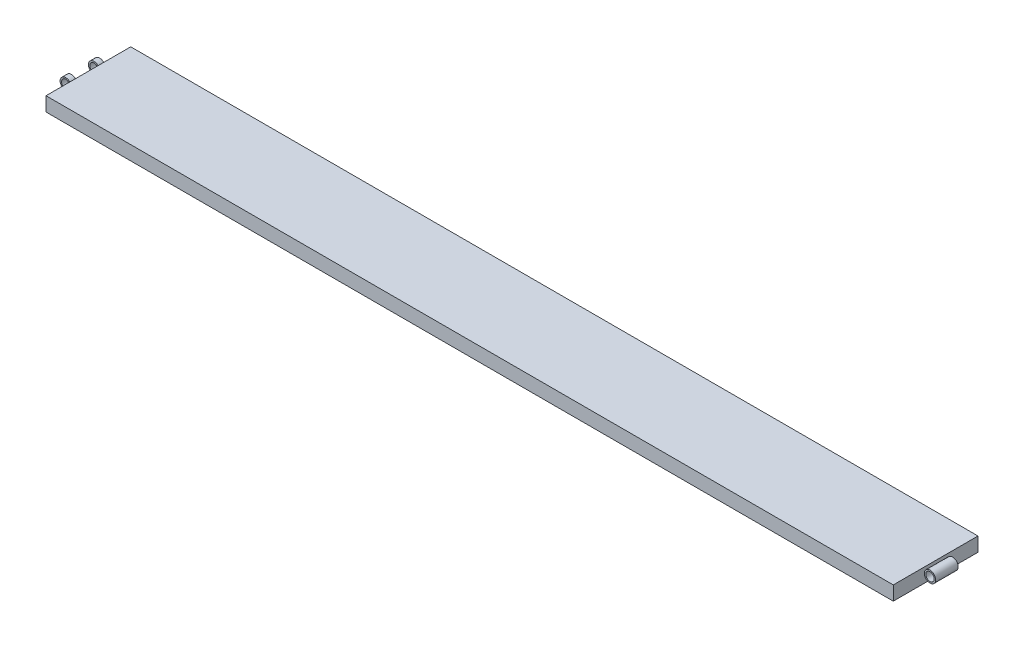
ISO-10303-21;
HEADER;
FILE_DESCRIPTION(('STEP AP214'),'2;1');
FILE_NAME('part.step','',(''),(''),'','','');
FILE_SCHEMA(('AUTOMOTIVE_DESIGN { 1 0 10303 214 1 1 1 1 }'));
ENDSEC;
DATA;
#1=APPLICATION_CONTEXT('core data for automotive mechanical design processes');
#2=APPLICATION_PROTOCOL_DEFINITION('international standard','automotive_design',2000,#1);
#3=PRODUCT_CONTEXT('',#1,'mechanical');
#4=PRODUCT('Part','Part','',(#3));
#5=PRODUCT_RELATED_PRODUCT_CATEGORY('part','',(#4));
#6=PRODUCT_DEFINITION_FORMATION('','',#4);
#7=PRODUCT_DEFINITION_CONTEXT('part definition',#1,'design');
#8=PRODUCT_DEFINITION('design','',#6,#7);
#9=PRODUCT_DEFINITION_SHAPE('','',#8);
#10=(LENGTH_UNIT() NAMED_UNIT(*) SI_UNIT(.MILLI.,.METRE.));
#11=(NAMED_UNIT(*) PLANE_ANGLE_UNIT() SI_UNIT($,.RADIAN.));
#12=(NAMED_UNIT(*) SI_UNIT($,.STERADIAN.) SOLID_ANGLE_UNIT());
#13=UNCERTAINTY_MEASURE_WITH_UNIT(LENGTH_MEASURE(1.E-05),#10,'distance_accuracy_value','');
#14=(GEOMETRIC_REPRESENTATION_CONTEXT(3) GLOBAL_UNCERTAINTY_ASSIGNED_CONTEXT((#13)) GLOBAL_UNIT_ASSIGNED_CONTEXT((#10,
#11,#12)) REPRESENTATION_CONTEXT('',''));
#15=CARTESIAN_POINT('',(0.,0.,0.));
#16=DIRECTION('',(0.,0.,1.));
#17=DIRECTION('',(1.,0.,0.));
#18=AXIS2_PLACEMENT_3D('',#15,#16,#17);
#19=CARTESIAN_POINT('',(383.54,3.87278977502286,-24.13));
#20=DIRECTION('',(0.,0.,1.));
#21=DIRECTION('',(1.,0.,0.));
#22=AXIS2_PLACEMENT_3D('',#19,#20,#21);
#23=CYLINDRICAL_SURFACE('',#22,2.53999999999996);
#24=CARTESIAN_POINT('',(383.54,3.87278977502286,-24.13));
#25=DIRECTION('',(0.,0.,1.));
#26=DIRECTION('',(-1.,0.,0.));
#27=AXIS2_PLACEMENT_3D('',#24,#25,#26);
#28=CIRCLE('',#27,2.53999999999996);
#29=CARTESIAN_POINT('',(381.,3.87278977502286,-24.13));
#30=VERTEX_POINT('',#29);
#31=EDGE_CURVE('E11',#30,#30,#28,.T.);
#32=ORIENTED_EDGE('',*,*,#31,.T.);
#33=EDGE_LOOP('',(#32));
#34=FACE_BOUND('',#33,.T.);
#35=CARTESIAN_POINT('',(383.54,3.87278977502286,-13.97));
#36=DIRECTION('',(0.,0.,1.));
#37=DIRECTION('',(-1.,0.,0.));
#38=AXIS2_PLACEMENT_3D('',#35,#36,#37);
#39=CIRCLE('',#38,2.53999999999996);
#40=CARTESIAN_POINT('',(381.,3.87278977502286,-13.97));
#41=VERTEX_POINT('',#40);
#42=EDGE_CURVE('E50',#41,#41,#39,.T.);
#43=ORIENTED_EDGE('',*,*,#42,.F.);
#44=EDGE_LOOP('',(#43));
#45=FACE_BOUND('',#44,.T.);
#46=ADVANCED_FACE('F40',(#34,#45),#23,.T.);
#47=CARTESIAN_POINT('',(383.54,3.87278977502286,-24.13));
#48=DIRECTION('',(0.,0.,-1.));
#49=DIRECTION('',(-1.,0.,0.));
#50=AXIS2_PLACEMENT_3D('',#47,#48,#49);
#51=PLANE('',#50);
#52=CARTESIAN_POINT('',(383.54,3.87278977502286,-24.13));
#53=DIRECTION('',(0.,0.,1.));
#54=DIRECTION('',(-1.,0.,0.));
#55=AXIS2_PLACEMENT_3D('',#52,#53,#54);
#56=CIRCLE('',#55,1.90499999999999);
#57=CARTESIAN_POINT('',(381.635,3.87278977502286,-24.13));
#58=VERTEX_POINT('',#57);
#59=EDGE_CURVE('E46',#58,#58,#56,.T.);
#60=ORIENTED_EDGE('',*,*,#59,.T.);
#61=EDGE_LOOP('',(#60));
#62=FACE_BOUND('',#61,.T.);
#63=ORIENTED_EDGE('',*,*,#31,.F.);
#64=EDGE_LOOP('',(#63));
#65=FACE_BOUND('',#64,.T.);
#66=ADVANCED_FACE('F69',(#62,#65),#51,.T.);
#67=CARTESIAN_POINT('',(383.54,3.87278977502286,-24.13));
#68=DIRECTION('',(0.,0.,1.));
#69=DIRECTION('',(1.,0.,0.));
#70=AXIS2_PLACEMENT_3D('',#67,#68,#69);
#71=CYLINDRICAL_SURFACE('',#70,1.90499999999999);
#72=ORIENTED_EDGE('',*,*,#59,.F.);
#73=EDGE_LOOP('',(#72));
#74=FACE_BOUND('',#73,.T.);
#75=CARTESIAN_POINT('',(383.54,3.87278977502286,-13.97));
#76=DIRECTION('',(0.,0.,1.));
#77=DIRECTION('',(-1.,0.,0.));
#78=AXIS2_PLACEMENT_3D('',#75,#76,#77);
#79=CIRCLE('',#78,1.90499999999999);
#80=CARTESIAN_POINT('',(381.635,3.87278977502286,-13.97));
#81=VERTEX_POINT('',#80);
#82=EDGE_CURVE('E54',#81,#81,#79,.T.);
#83=ORIENTED_EDGE('',*,*,#82,.T.);
#84=EDGE_LOOP('',(#83));
#85=FACE_BOUND('',#84,.T.);
#86=ADVANCED_FACE('F60',(#74,#85),#71,.F.);
#87=CARTESIAN_POINT('',(383.54,3.87278977502286,-13.97));
#88=DIRECTION('',(0.,0.,-1.));
#89=DIRECTION('',(-1.,0.,0.));
#90=AXIS2_PLACEMENT_3D('',#87,#88,#89);
#91=PLANE('',#90);
#92=ORIENTED_EDGE('',*,*,#42,.T.);
#93=EDGE_LOOP('',(#92));
#94=FACE_BOUND('',#93,.T.);
#95=ORIENTED_EDGE('',*,*,#82,.F.);
#96=EDGE_LOOP('',(#95));
#97=FACE_BOUND('',#96,.T.);
#98=ADVANCED_FACE('F62',(#94,#97),#91,.F.);
#99=CLOSED_SHELL('',(#46,#66,#86,#98));
#100=MANIFOLD_SOLID_BREP('B2',#99);
#101=CARTESIAN_POINT('',(-2.54,3.87278977502286,-26.67));
#102=DIRECTION('',(0.,0.,1.));
#103=DIRECTION('',(1.,0.,0.));
#104=AXIS2_PLACEMENT_3D('',#101,#102,#103);
#105=CYLINDRICAL_SURFACE('',#104,2.54);
#106=CARTESIAN_POINT('',(-2.54,3.87278977502286,-26.67));
#107=DIRECTION('',(0.,0.,1.));
#108=DIRECTION('',(1.,0.,0.));
#109=AXIS2_PLACEMENT_3D('',#106,#107,#108);
#110=CIRCLE('',#109,2.54);
#111=CARTESIAN_POINT('',(0.,3.87278977502286,-26.67));
#112=VERTEX_POINT('',#111);
#113=EDGE_CURVE('E39',#112,#112,#110,.T.);
#114=ORIENTED_EDGE('',*,*,#113,.T.);
#115=EDGE_LOOP('',(#114));
#116=FACE_BOUND('',#115,.T.);
#117=CARTESIAN_POINT('',(-2.54,3.87278977502286,-24.13));
#118=DIRECTION('',(0.,0.,1.));
#119=DIRECTION('',(1.,0.,0.));
#120=AXIS2_PLACEMENT_3D('',#117,#118,#119);
#121=CIRCLE('',#120,2.54);
#122=CARTESIAN_POINT('',(0.,3.87278977502286,-24.13));
#123=VERTEX_POINT('',#122);
#124=EDGE_CURVE('E120',#123,#123,#121,.T.);
#125=ORIENTED_EDGE('',*,*,#124,.F.);
#126=EDGE_LOOP('',(#125));
#127=FACE_BOUND('',#126,.T.);
#128=ADVANCED_FACE('F110',(#116,#127),#105,.T.);
#129=CARTESIAN_POINT('',(-2.54,3.87278977502286,-26.67));
#130=DIRECTION('',(0.,0.,1.));
#131=DIRECTION('',(1.,0.,0.));
#132=AXIS2_PLACEMENT_3D('',#129,#130,#131);
#133=PLANE('',#132);
#134=CARTESIAN_POINT('',(-2.54,3.87278977502286,-26.67));
#135=DIRECTION('',(0.,0.,1.));
#136=DIRECTION('',(1.,0.,0.));
#137=AXIS2_PLACEMENT_3D('',#134,#135,#136);
#138=CIRCLE('',#137,1.905);
#139=CARTESIAN_POINT('',(-0.635000000000001,3.87278977502286,-26.67));
#140=VERTEX_POINT('',#139);
#141=EDGE_CURVE('E116',#140,#140,#138,.T.);
#142=ORIENTED_EDGE('',*,*,#141,.T.);
#143=EDGE_LOOP('',(#142));
#144=FACE_BOUND('',#143,.T.);
#145=ORIENTED_EDGE('',*,*,#113,.F.);
#146=EDGE_LOOP('',(#145));
#147=FACE_BOUND('',#146,.T.);
#148=ADVANCED_FACE('F139',(#144,#147),#133,.F.);
#149=CARTESIAN_POINT('',(-2.54,3.87278977502286,-26.67));
#150=DIRECTION('',(0.,0.,1.));
#151=DIRECTION('',(1.,0.,0.));
#152=AXIS2_PLACEMENT_3D('',#149,#150,#151);
#153=CYLINDRICAL_SURFACE('',#152,1.905);
#154=ORIENTED_EDGE('',*,*,#141,.F.);
#155=EDGE_LOOP('',(#154));
#156=FACE_BOUND('',#155,.T.);
#157=CARTESIAN_POINT('',(-2.54,3.87278977502286,-24.13));
#158=DIRECTION('',(0.,0.,1.));
#159=DIRECTION('',(1.,0.,0.));
#160=AXIS2_PLACEMENT_3D('',#157,#158,#159);
#161=CIRCLE('',#160,1.905);
#162=CARTESIAN_POINT('',(-0.635000000000001,3.87278977502286,-24.13));
#163=VERTEX_POINT('',#162);
#164=EDGE_CURVE('E124',#163,#163,#161,.T.);
#165=ORIENTED_EDGE('',*,*,#164,.T.);
#166=EDGE_LOOP('',(#165));
#167=FACE_BOUND('',#166,.T.);
#168=ADVANCED_FACE('F130',(#156,#167),#153,.F.);
#169=CARTESIAN_POINT('',(-2.54,3.87278977502286,-24.13));
#170=DIRECTION('',(0.,0.,1.));
#171=DIRECTION('',(1.,0.,0.));
#172=AXIS2_PLACEMENT_3D('',#169,#170,#171);
#173=PLANE('',#172);
#174=ORIENTED_EDGE('',*,*,#124,.T.);
#175=EDGE_LOOP('',(#174));
#176=FACE_BOUND('',#175,.T.);
#177=ORIENTED_EDGE('',*,*,#164,.F.);
#178=EDGE_LOOP('',(#177));
#179=FACE_BOUND('',#178,.T.);
#180=ADVANCED_FACE('F132',(#176,#179),#173,.T.);
#181=CLOSED_SHELL('',(#128,#148,#168,#180));
#182=MANIFOLD_SOLID_BREP('B6',#181);
#183=CARTESIAN_POINT('',(-2.54,3.87278977502286,-13.97));
#184=DIRECTION('',(0.,0.,1.));
#185=DIRECTION('',(1.,0.,0.));
#186=AXIS2_PLACEMENT_3D('',#183,#184,#185);
#187=CYLINDRICAL_SURFACE('',#186,2.54);
#188=CARTESIAN_POINT('',(-2.54,3.87278977502286,-13.97));
#189=DIRECTION('',(0.,0.,1.));
#190=DIRECTION('',(1.,0.,0.));
#191=AXIS2_PLACEMENT_3D('',#188,#189,#190);
#192=CIRCLE('',#191,2.54);
#193=CARTESIAN_POINT('',(0.,3.87278977502286,-13.97));
#194=VERTEX_POINT('',#193);
#195=EDGE_CURVE('E109',#194,#194,#192,.T.);
#196=ORIENTED_EDGE('',*,*,#195,.T.);
#197=EDGE_LOOP('',(#196));
#198=FACE_BOUND('',#197,.T.);
#199=CARTESIAN_POINT('',(-2.54,3.87278977502286,-11.43));
#200=DIRECTION('',(0.,0.,1.));
#201=DIRECTION('',(1.,0.,0.));
#202=AXIS2_PLACEMENT_3D('',#199,#200,#201);
#203=CIRCLE('',#202,2.54);
#204=CARTESIAN_POINT('',(0.,3.87278977502286,-11.43));
#205=VERTEX_POINT('',#204);
#206=EDGE_CURVE('E191',#205,#205,#203,.T.);
#207=ORIENTED_EDGE('',*,*,#206,.F.);
#208=EDGE_LOOP('',(#207));
#209=FACE_BOUND('',#208,.T.);
#210=ADVANCED_FACE('F181',(#198,#209),#187,.T.);
#211=CARTESIAN_POINT('',(-2.54,3.87278977502286,-13.97));
#212=DIRECTION('',(0.,0.,1.));
#213=DIRECTION('',(1.,0.,0.));
#214=AXIS2_PLACEMENT_3D('',#211,#212,#213);
#215=PLANE('',#214);
#216=CARTESIAN_POINT('',(-2.54,3.87278977502286,-13.97));
#217=DIRECTION('',(0.,0.,1.));
#218=DIRECTION('',(1.,0.,0.));
#219=AXIS2_PLACEMENT_3D('',#216,#217,#218);
#220=CIRCLE('',#219,1.905);
#221=CARTESIAN_POINT('',(-0.635000000000001,3.87278977502286,-13.97));
#222=VERTEX_POINT('',#221);
#223=EDGE_CURVE('E187',#222,#222,#220,.T.);
#224=ORIENTED_EDGE('',*,*,#223,.T.);
#225=EDGE_LOOP('',(#224));
#226=FACE_BOUND('',#225,.T.);
#227=ORIENTED_EDGE('',*,*,#195,.F.);
#228=EDGE_LOOP('',(#227));
#229=FACE_BOUND('',#228,.T.);
#230=ADVANCED_FACE('F210',(#226,#229),#215,.F.);
#231=CARTESIAN_POINT('',(-2.54,3.87278977502286,-13.97));
#232=DIRECTION('',(0.,0.,1.));
#233=DIRECTION('',(1.,0.,0.));
#234=AXIS2_PLACEMENT_3D('',#231,#232,#233);
#235=CYLINDRICAL_SURFACE('',#234,1.905);
#236=ORIENTED_EDGE('',*,*,#223,.F.);
#237=EDGE_LOOP('',(#236));
#238=FACE_BOUND('',#237,.T.);
#239=CARTESIAN_POINT('',(-2.54,3.87278977502286,-11.43));
#240=DIRECTION('',(0.,0.,1.));
#241=DIRECTION('',(1.,0.,0.));
#242=AXIS2_PLACEMENT_3D('',#239,#240,#241);
#243=CIRCLE('',#242,1.905);
#244=CARTESIAN_POINT('',(-0.635000000000001,3.87278977502286,-11.43));
#245=VERTEX_POINT('',#244);
#246=EDGE_CURVE('E195',#245,#245,#243,.T.);
#247=ORIENTED_EDGE('',*,*,#246,.T.);
#248=EDGE_LOOP('',(#247));
#249=FACE_BOUND('',#248,.T.);
#250=ADVANCED_FACE('F201',(#238,#249),#235,.F.);
#251=CARTESIAN_POINT('',(-2.54,3.87278977502286,-11.43));
#252=DIRECTION('',(0.,0.,1.));
#253=DIRECTION('',(1.,0.,0.));
#254=AXIS2_PLACEMENT_3D('',#251,#252,#253);
#255=PLANE('',#254);
#256=ORIENTED_EDGE('',*,*,#206,.T.);
#257=EDGE_LOOP('',(#256));
#258=FACE_BOUND('',#257,.T.);
#259=ORIENTED_EDGE('',*,*,#246,.F.);
#260=EDGE_LOOP('',(#259));
#261=FACE_BOUND('',#260,.T.);
#262=ADVANCED_FACE('F203',(#258,#261),#255,.T.);
#263=CLOSED_SHELL('',(#210,#230,#250,#262));
#264=MANIFOLD_SOLID_BREP('B34',#263);
#265=CARTESIAN_POINT('',(0.,6.35,0.));
#266=DIRECTION('',(1.,0.,0.));
#267=DIRECTION('',(0.,0.,-1.));
#268=AXIS2_PLACEMENT_3D('',#265,#266,#267);
#269=PLANE('',#268);
#270=DIRECTION('',(0.,0.,1.));
#271=VECTOR('',#270,1.);
#272=CARTESIAN_POINT('',(0.,0.,0.));
#273=LINE('',#272,#271);
#274=CARTESIAN_POINT('',(0.,0.,-38.1));
#275=VERTEX_POINT('',#274);
#276=CARTESIAN_POINT('',(0.,0.,0.));
#277=VERTEX_POINT('',#276);
#278=EDGE_CURVE('E306',#275,#277,#273,.T.);
#279=ORIENTED_EDGE('',*,*,#278,.T.);
#280=DIRECTION('',(0.,-1.,0.));
#281=VECTOR('',#280,1.);
#282=CARTESIAN_POINT('',(0.,6.35,0.));
#283=LINE('',#282,#281);
#284=CARTESIAN_POINT('',(0.,6.35,0.));
#285=VERTEX_POINT('',#284);
#286=EDGE_CURVE('E179',#285,#277,#283,.T.);
#287=ORIENTED_EDGE('',*,*,#286,.F.);
#288=DIRECTION('',(0.,0.,1.));
#289=VECTOR('',#288,1.);
#290=CARTESIAN_POINT('',(0.,6.35,0.));
#291=LINE('',#290,#289);
#292=CARTESIAN_POINT('',(0.,6.35,-38.1));
#293=VERTEX_POINT('',#292);
#294=EDGE_CURVE('E294',#293,#285,#291,.T.);
#295=ORIENTED_EDGE('',*,*,#294,.F.);
#296=DIRECTION('',(0.,-1.,0.));
#297=VECTOR('',#296,1.);
#298=CARTESIAN_POINT('',(0.,6.35,-38.1));
#299=LINE('',#298,#297);
#300=EDGE_CURVE('E302',#293,#275,#299,.T.);
#301=ORIENTED_EDGE('',*,*,#300,.T.);
#302=EDGE_LOOP('',(#279,#287,#295,#301));
#303=FACE_BOUND('',#302,.T.);
#304=ADVANCED_FACE('F243',(#303),#269,.F.);
#305=CARTESIAN_POINT('',(0.,6.35,0.));
#306=DIRECTION('',(0.,0.,-1.));
#307=DIRECTION('',(-1.,0.,0.));
#308=AXIS2_PLACEMENT_3D('',#305,#306,#307);
#309=PLANE('',#308);
#310=DIRECTION('',(1.,0.,0.));
#311=VECTOR('',#310,1.);
#312=CARTESIAN_POINT('',(0.,0.,0.));
#313=LINE('',#312,#311);
#314=CARTESIAN_POINT('',(381.,0.,0.));
#315=VERTEX_POINT('',#314);
#316=EDGE_CURVE('E298',#277,#315,#313,.T.);
#317=ORIENTED_EDGE('',*,*,#316,.T.);
#318=DIRECTION('',(0.,-1.,0.));
#319=VECTOR('',#318,1.);
#320=CARTESIAN_POINT('',(381.,6.35,0.));
#321=LINE('',#320,#319);
#322=CARTESIAN_POINT('',(381.,6.35,0.));
#323=VERTEX_POINT('',#322);
#324=EDGE_CURVE('E251',#323,#315,#321,.T.);
#325=ORIENTED_EDGE('',*,*,#324,.F.);
#326=DIRECTION('',(1.,0.,0.));
#327=VECTOR('',#326,1.);
#328=CARTESIAN_POINT('',(0.,6.35,0.));
#329=LINE('',#328,#327);
#330=EDGE_CURVE('E289',#285,#323,#329,.T.);
#331=ORIENTED_EDGE('',*,*,#330,.F.);
#332=ORIENTED_EDGE('',*,*,#286,.T.);
#333=EDGE_LOOP('',(#317,#325,#331,#332));
#334=FACE_BOUND('',#333,.T.);
#335=ADVANCED_FACE('F297',(#334),#309,.F.);
#336=CARTESIAN_POINT('',(381.,6.35,0.));
#337=DIRECTION('',(-1.,0.,0.));
#338=DIRECTION('',(0.,0.,1.));
#339=AXIS2_PLACEMENT_3D('',#336,#337,#338);
#340=PLANE('',#339);
#341=DIRECTION('',(0.,0.,-1.));
#342=VECTOR('',#341,1.);
#343=CARTESIAN_POINT('',(381.,0.,0.));
#344=LINE('',#343,#342);
#345=CARTESIAN_POINT('',(381.,0.,-38.1));
#346=VERTEX_POINT('',#345);
#347=EDGE_CURVE('E276',#315,#346,#344,.T.);
#348=ORIENTED_EDGE('',*,*,#347,.T.);
#349=DIRECTION('',(0.,-1.,0.));
#350=VECTOR('',#349,1.);
#351=CARTESIAN_POINT('',(381.,6.35,-38.1));
#352=LINE('',#351,#350);
#353=CARTESIAN_POINT('',(381.,6.35,-38.1));
#354=VERTEX_POINT('',#353);
#355=EDGE_CURVE('E299',#354,#346,#352,.T.);
#356=ORIENTED_EDGE('',*,*,#355,.F.);
#357=DIRECTION('',(0.,0.,-1.));
#358=VECTOR('',#357,1.);
#359=CARTESIAN_POINT('',(381.,6.35,0.));
#360=LINE('',#359,#358);
#361=EDGE_CURVE('E292',#323,#354,#360,.T.);
#362=ORIENTED_EDGE('',*,*,#361,.F.);
#363=ORIENTED_EDGE('',*,*,#324,.T.);
#364=EDGE_LOOP('',(#348,#356,#362,#363));
#365=FACE_BOUND('',#364,.T.);
#366=ADVANCED_FACE('F300',(#365),#340,.F.);
#367=CARTESIAN_POINT('',(0.,6.35,-38.1));
#368=DIRECTION('',(0.,0.,1.));
#369=DIRECTION('',(1.,0.,0.));
#370=AXIS2_PLACEMENT_3D('',#367,#368,#369);
#371=PLANE('',#370);
#372=DIRECTION('',(-1.,0.,0.));
#373=VECTOR('',#372,1.);
#374=CARTESIAN_POINT('',(0.,0.,-38.1));
#375=LINE('',#374,#373);
#376=EDGE_CURVE('E282',#346,#275,#375,.T.);
#377=ORIENTED_EDGE('',*,*,#376,.T.);
#378=ORIENTED_EDGE('',*,*,#300,.F.);
#379=DIRECTION('',(-1.,0.,0.));
#380=VECTOR('',#379,1.);
#381=CARTESIAN_POINT('',(0.,6.35,-38.1));
#382=LINE('',#381,#380);
#383=EDGE_CURVE('E259',#354,#293,#382,.T.);
#384=ORIENTED_EDGE('',*,*,#383,.F.);
#385=ORIENTED_EDGE('',*,*,#355,.T.);
#386=EDGE_LOOP('',(#377,#378,#384,#385));
#387=FACE_BOUND('',#386,.T.);
#388=ADVANCED_FACE('F313',(#387),#371,.F.);
#389=CARTESIAN_POINT('',(0.,6.35,0.));
#390=DIRECTION('',(0.,-1.,0.));
#391=DIRECTION('',(0.,0.,-1.));
#392=AXIS2_PLACEMENT_3D('',#389,#390,#391);
#393=PLANE('',#392);
#394=ORIENTED_EDGE('',*,*,#294,.T.);
#395=ORIENTED_EDGE('',*,*,#330,.T.);
#396=ORIENTED_EDGE('',*,*,#361,.T.);
#397=ORIENTED_EDGE('',*,*,#383,.T.);
#398=EDGE_LOOP('',(#394,#395,#396,#397));
#399=FACE_BOUND('',#398,.T.);
#400=ADVANCED_FACE('F290',(#399),#393,.F.);
#401=CARTESIAN_POINT('',(0.,0.,0.));
#402=DIRECTION('',(0.,-1.,0.));
#403=DIRECTION('',(0.,0.,-1.));
#404=AXIS2_PLACEMENT_3D('',#401,#402,#403);
#405=PLANE('',#404);
#406=ORIENTED_EDGE('',*,*,#278,.F.);
#407=ORIENTED_EDGE('',*,*,#376,.F.);
#408=ORIENTED_EDGE('',*,*,#347,.F.);
#409=ORIENTED_EDGE('',*,*,#316,.F.);
#410=EDGE_LOOP('',(#406,#407,#408,#409));
#411=FACE_BOUND('',#410,.T.);
#412=ADVANCED_FACE('F316',(#411),#405,.T.);
#413=CLOSED_SHELL('',(#304,#335,#366,#388,#400,#412));
#414=MANIFOLD_SOLID_BREP('B104',#413);
#415=ADVANCED_BREP_SHAPE_REPRESENTATION('',(#18,#100,#182,#264,#414),#14);
#416=SHAPE_DEFINITION_REPRESENTATION(#9,#415);
ENDSEC;
END-ISO-10303-21;
